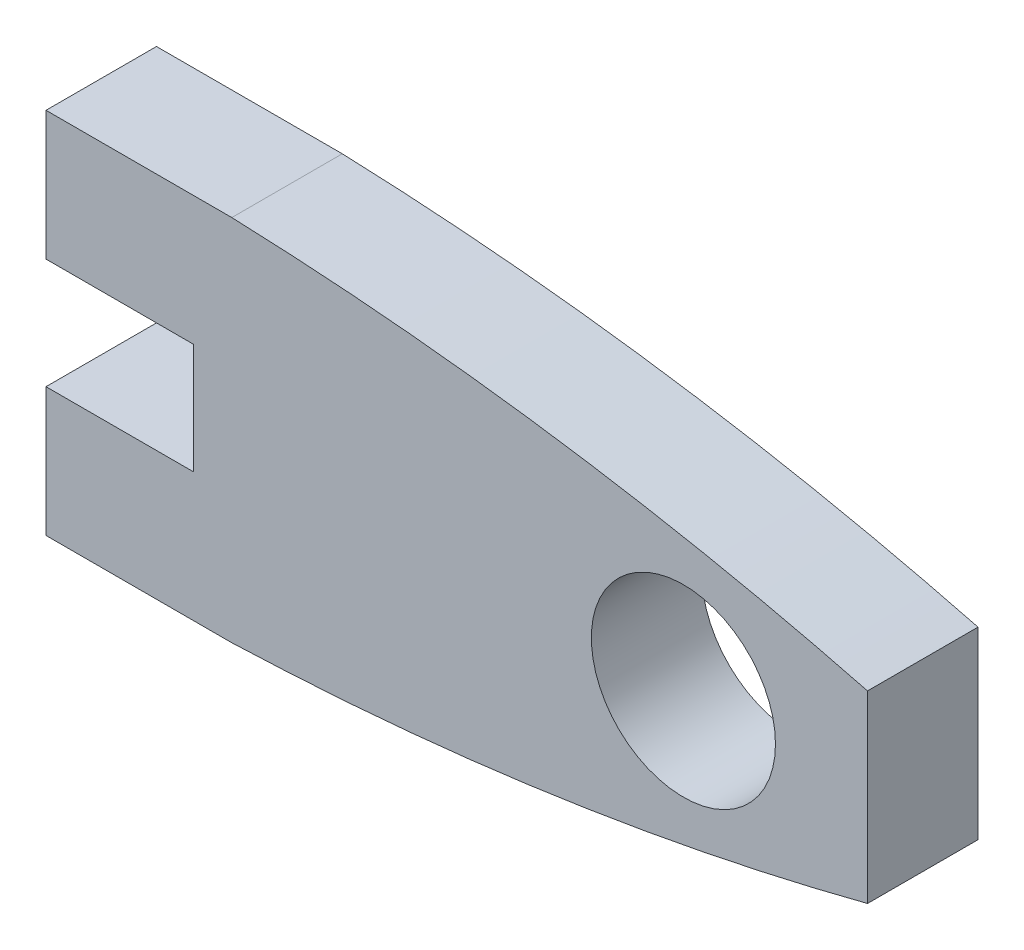
ISO-10303-21;
HEADER;
FILE_DESCRIPTION(('STEP AP214'),'2;1');
FILE_NAME('part.step','',(''),(''),'','','');
FILE_SCHEMA(('AUTOMOTIVE_DESIGN { 1 0 10303 214 1 1 1 1 }'));
ENDSEC;
DATA;
#1=APPLICATION_CONTEXT('core data for automotive mechanical design processes');
#2=APPLICATION_PROTOCOL_DEFINITION('international standard','automotive_design',2000,#1);
#3=PRODUCT_CONTEXT('',#1,'mechanical');
#4=PRODUCT('Part','Part','',(#3));
#5=PRODUCT_RELATED_PRODUCT_CATEGORY('part','',(#4));
#6=PRODUCT_DEFINITION_FORMATION('','',#4);
#7=PRODUCT_DEFINITION_CONTEXT('part definition',#1,'design');
#8=PRODUCT_DEFINITION('design','',#6,#7);
#9=PRODUCT_DEFINITION_SHAPE('','',#8);
#10=(LENGTH_UNIT() NAMED_UNIT(*) SI_UNIT(.MILLI.,.METRE.));
#11=(NAMED_UNIT(*) PLANE_ANGLE_UNIT() SI_UNIT($,.RADIAN.));
#12=(NAMED_UNIT(*) SI_UNIT($,.STERADIAN.) SOLID_ANGLE_UNIT());
#13=UNCERTAINTY_MEASURE_WITH_UNIT(LENGTH_MEASURE(1.E-05),#10,'distance_accuracy_value','');
#14=(GEOMETRIC_REPRESENTATION_CONTEXT(3) GLOBAL_UNCERTAINTY_ASSIGNED_CONTEXT((#13)) GLOBAL_UNIT_ASSIGNED_CONTEXT((#10,
#11,#12)) REPRESENTATION_CONTEXT('',''));
#15=CARTESIAN_POINT('',(0.,0.,0.));
#16=DIRECTION('',(0.,0.,1.));
#17=DIRECTION('',(1.,0.,0.));
#18=AXIS2_PLACEMENT_3D('',#15,#16,#17);
#19=CARTESIAN_POINT('',(0.,-4.99999999999999,3.));
#20=DIRECTION('',(0.,1.,0.));
#21=DIRECTION('',(0.,0.,1.));
#22=AXIS2_PLACEMENT_3D('',#19,#20,#21);
#23=PLANE('',#22);
#24=DIRECTION('',(1.,0.,0.));
#25=VECTOR('',#24,1.);
#26=CARTESIAN_POINT('',(0.,-4.99999999999999,3.));
#27=LINE('',#26,#25);
#28=CARTESIAN_POINT('',(-10.6544117647059,-4.99999999999999,3.));
#29=VERTEX_POINT('',#28);
#30=CARTESIAN_POINT('',(-5.60878524619494,-4.99999999999999,3.));
#31=VERTEX_POINT('',#30);
#32=EDGE_CURVE('E123',#29,#31,#27,.T.);
#33=ORIENTED_EDGE('',*,*,#32,.F.);
#34=DIRECTION('',(0.,0.,1.));
#35=VECTOR('',#34,1.);
#36=CARTESIAN_POINT('',(-10.6544117647059,-4.99999999999999,-0.00100000000000013));
#37=LINE('',#36,#35);
#38=CARTESIAN_POINT('',(-10.6544117647059,-4.99999999999999,0.));
#39=VERTEX_POINT('',#38);
#40=EDGE_CURVE('E110',#39,#29,#37,.T.);
#41=ORIENTED_EDGE('',*,*,#40,.F.);
#42=DIRECTION('',(1.,0.,0.));
#43=VECTOR('',#42,1.);
#44=CARTESIAN_POINT('',(0.,-4.99999999999999,0.));
#45=LINE('',#44,#43);
#46=CARTESIAN_POINT('',(-5.60878524619494,-4.99999999999999,0.));
#47=VERTEX_POINT('',#46);
#48=EDGE_CURVE('E295',#39,#47,#45,.T.);
#49=ORIENTED_EDGE('',*,*,#48,.T.);
#50=DIRECTION('',(0.,0.,-1.));
#51=VECTOR('',#50,1.);
#52=CARTESIAN_POINT('',(-5.60878524619494,-4.99999999999999,3.));
#53=LINE('',#52,#51);
#54=EDGE_CURVE('E11',#31,#47,#53,.T.);
#55=ORIENTED_EDGE('',*,*,#54,.F.);
#56=EDGE_LOOP('',(#33,#41,#49,#55));
#57=FACE_BOUND('',#56,.T.);
#58=ADVANCED_FACE('F35',(#57),#23,.F.);
#59=CARTESIAN_POINT('',(-11.6544117647059,-4.99999999999999,3.));
#60=CARTESIAN_POINT('',(0.349854090838662,-5.42490098130325,3.));
#61=CARTESIAN_POINT('',(11.6544117647059,-2.5,3.));
#62=B_SPLINE_CURVE_WITH_KNOTS('',2,(#59,#60,#61),.UNSPECIFIED.,.F.,.F.,(3,3),(0.,
0.737930507445409),.UNSPECIFIED.);
#63=DIRECTION('',(0.,0.,-1.));
#64=VECTOR('',#63,1.);
#65=SURFACE_OF_LINEAR_EXTRUSION('',#62,#64);
#66=CARTESIAN_POINT('',(-11.6544117647059,-4.99999999999999,0.));
#67=CARTESIAN_POINT('',(0.349854090838662,-5.42490098130325,0.));
#68=CARTESIAN_POINT('',(11.6544117647059,-2.5,0.));
#69=B_SPLINE_CURVE_WITH_KNOTS('',2,(#66,#67,#68),.UNSPECIFIED.,.F.,.F.,(3,3),(0.,
0.737930507445409),.UNSPECIFIED.);
#70=CARTESIAN_POINT('',(11.6544117647059,-2.5,0.));
#71=VERTEX_POINT('',#70);
#72=EDGE_CURVE('E298',#47,#71,#69,.T.);
#73=ORIENTED_EDGE('',*,*,#72,.T.);
#74=DIRECTION('',(0.,0.,-1.));
#75=VECTOR('',#74,1.);
#76=CARTESIAN_POINT('',(11.6544117647059,-2.5,3.));
#77=LINE('',#76,#75);
#78=CARTESIAN_POINT('',(11.6544117647059,-2.5,3.));
#79=VERTEX_POINT('',#78);
#80=EDGE_CURVE('E43',#79,#71,#77,.T.);
#81=ORIENTED_EDGE('',*,*,#80,.F.);
#82=EDGE_CURVE('E129',#31,#79,#62,.T.);
#83=ORIENTED_EDGE('',*,*,#82,.F.);
#84=ORIENTED_EDGE('',*,*,#54,.T.);
#85=EDGE_LOOP('',(#73,#81,#83,#84));
#86=FACE_BOUND('',#85,.T.);
#87=ADVANCED_FACE('F147',(#86),#65,.F.);
#88=CARTESIAN_POINT('',(11.6544117647059,0.,3.));
#89=DIRECTION('',(1.,0.,0.));
#90=DIRECTION('',(0.,1.,0.));
#91=AXIS2_PLACEMENT_3D('',#88,#89,#90);
#92=PLANE('',#91);
#93=DIRECTION('',(0.,-1.,0.));
#94=VECTOR('',#93,1.);
#95=CARTESIAN_POINT('',(11.6544117647059,0.,0.));
#96=LINE('',#95,#94);
#97=CARTESIAN_POINT('',(11.6544117647059,2.5,0.));
#98=VERTEX_POINT('',#97);
#99=EDGE_CURVE('E303',#98,#71,#96,.T.);
#100=ORIENTED_EDGE('',*,*,#99,.F.);
#101=DIRECTION('',(0.,0.,-1.));
#102=VECTOR('',#101,1.);
#103=CARTESIAN_POINT('',(11.6544117647059,2.5,3.));
#104=LINE('',#103,#102);
#105=CARTESIAN_POINT('',(11.6544117647059,2.5,3.));
#106=VERTEX_POINT('',#105);
#107=EDGE_CURVE('E323',#106,#98,#104,.T.);
#108=ORIENTED_EDGE('',*,*,#107,.F.);
#109=DIRECTION('',(0.,-1.,0.));
#110=VECTOR('',#109,1.);
#111=CARTESIAN_POINT('',(11.6544117647059,0.,3.));
#112=LINE('',#111,#110);
#113=EDGE_CURVE('E132',#106,#79,#112,.T.);
#114=ORIENTED_EDGE('',*,*,#113,.T.);
#115=ORIENTED_EDGE('',*,*,#80,.T.);
#116=EDGE_LOOP('',(#100,#108,#114,#115));
#117=FACE_BOUND('',#116,.T.);
#118=ADVANCED_FACE('F150',(#117),#92,.T.);
#119=CARTESIAN_POINT('',(-11.6544117647059,4.99999999999999,3.));
#120=CARTESIAN_POINT('',(0.349854090838653,5.42490098130326,3.));
#121=CARTESIAN_POINT('',(11.6544117647059,2.5,3.));
#122=B_SPLINE_CURVE_WITH_KNOTS('',2,(#119,#120,#121),.UNSPECIFIED.,.F.,.F.,(3,3),(0.,
0.73793050744541),.UNSPECIFIED.);
#123=DIRECTION('',(0.,0.,-1.));
#124=VECTOR('',#123,1.);
#125=SURFACE_OF_LINEAR_EXTRUSION('',#122,#124);
#126=CARTESIAN_POINT('',(-11.6544117647059,4.99999999999999,0.));
#127=CARTESIAN_POINT('',(0.349854090838653,5.42490098130326,0.));
#128=CARTESIAN_POINT('',(11.6544117647059,2.5,0.));
#129=B_SPLINE_CURVE_WITH_KNOTS('',2,(#126,#127,#128),.UNSPECIFIED.,.F.,.F.,(3,3),(0.,
0.73793050744541),.UNSPECIFIED.);
#130=CARTESIAN_POINT('',(-5.6087852461947,4.99999999999999,0.));
#131=VERTEX_POINT('',#130);
#132=EDGE_CURVE('E309',#131,#98,#129,.T.);
#133=ORIENTED_EDGE('',*,*,#132,.F.);
#134=DIRECTION('',(0.,0.,-1.));
#135=VECTOR('',#134,1.);
#136=CARTESIAN_POINT('',(-5.6087852461947,4.99999999999999,3.));
#137=LINE('',#136,#135);
#138=CARTESIAN_POINT('',(-5.6087852461947,4.99999999999999,3.));
#139=VERTEX_POINT('',#138);
#140=EDGE_CURVE('E291',#139,#131,#137,.T.);
#141=ORIENTED_EDGE('',*,*,#140,.F.);
#142=EDGE_CURVE('E278',#139,#106,#122,.T.);
#143=ORIENTED_EDGE('',*,*,#142,.T.);
#144=ORIENTED_EDGE('',*,*,#107,.T.);
#145=EDGE_LOOP('',(#133,#141,#143,#144));
#146=FACE_BOUND('',#145,.T.);
#147=ADVANCED_FACE('F168',(#146),#125,.T.);
#148=CARTESIAN_POINT('',(0.,4.99999999999999,3.));
#149=DIRECTION('',(0.,1.,0.));
#150=DIRECTION('',(-1.,0.,0.));
#151=AXIS2_PLACEMENT_3D('',#148,#149,#150);
#152=PLANE('',#151);
#153=DIRECTION('',(0.,0.,1.));
#154=VECTOR('',#153,1.);
#155=CARTESIAN_POINT('',(-10.6544117647059,4.99999999999999,-0.00100000000000013));
#156=LINE('',#155,#154);
#157=CARTESIAN_POINT('',(-10.6544117647059,4.99999999999999,0.));
#158=VERTEX_POINT('',#157);
#159=CARTESIAN_POINT('',(-10.6544117647059,4.99999999999999,3.));
#160=VERTEX_POINT('',#159);
#161=EDGE_CURVE('E339',#158,#160,#156,.T.);
#162=ORIENTED_EDGE('',*,*,#161,.T.);
#163=DIRECTION('',(1.,0.,0.));
#164=VECTOR('',#163,1.);
#165=CARTESIAN_POINT('',(0.,4.99999999999999,3.));
#166=LINE('',#165,#164);
#167=EDGE_CURVE('E284',#160,#139,#166,.T.);
#168=ORIENTED_EDGE('',*,*,#167,.T.);
#169=ORIENTED_EDGE('',*,*,#140,.T.);
#170=DIRECTION('',(1.,0.,0.));
#171=VECTOR('',#170,1.);
#172=CARTESIAN_POINT('',(0.,4.99999999999999,0.));
#173=LINE('',#172,#171);
#174=EDGE_CURVE('E314',#158,#131,#173,.T.);
#175=ORIENTED_EDGE('',*,*,#174,.F.);
#176=EDGE_LOOP('',(#162,#168,#169,#175));
#177=FACE_BOUND('',#176,.T.);
#178=ADVANCED_FACE('F175',(#177),#152,.T.);
#179=CARTESIAN_POINT('',(-6.65441176470586,0.,3.));
#180=DIRECTION('',(1.,0.,0.));
#181=DIRECTION('',(0.,1.,0.));
#182=AXIS2_PLACEMENT_3D('',#179,#180,#181);
#183=PLANE('',#182);
#184=DIRECTION('',(0.,-1.,0.));
#185=VECTOR('',#184,1.);
#186=CARTESIAN_POINT('',(-6.65441176470586,0.,0.));
#187=LINE('',#186,#185);
#188=CARTESIAN_POINT('',(-6.65441176470587,1.5,0.));
#189=VERTEX_POINT('',#188);
#190=CARTESIAN_POINT('',(-6.65441176470587,-1.5,0.));
#191=VERTEX_POINT('',#190);
#192=EDGE_CURVE('E135',#189,#191,#187,.T.);
#193=ORIENTED_EDGE('',*,*,#192,.T.);
#194=DIRECTION('',(0.,0.,1.));
#195=VECTOR('',#194,1.);
#196=CARTESIAN_POINT('',(-6.65441176470587,-1.5,0.));
#197=LINE('',#196,#195);
#198=CARTESIAN_POINT('',(-6.65441176470587,-1.5,3.));
#199=VERTEX_POINT('',#198);
#200=EDGE_CURVE('E349',#191,#199,#197,.T.);
#201=ORIENTED_EDGE('',*,*,#200,.T.);
#202=DIRECTION('',(0.,-1.,0.));
#203=VECTOR('',#202,1.);
#204=CARTESIAN_POINT('',(-6.65441176470586,0.,3.));
#205=LINE('',#204,#203);
#206=CARTESIAN_POINT('',(-6.65441176470587,1.5,3.));
#207=VERTEX_POINT('',#206);
#208=EDGE_CURVE('E289',#207,#199,#205,.T.);
#209=ORIENTED_EDGE('',*,*,#208,.F.);
#210=DIRECTION('',(0.,0.,1.));
#211=VECTOR('',#210,1.);
#212=CARTESIAN_POINT('',(-6.65441176470587,1.5,0.));
#213=LINE('',#212,#211);
#214=EDGE_CURVE('E296',#189,#207,#213,.T.);
#215=ORIENTED_EDGE('',*,*,#214,.F.);
#216=EDGE_LOOP('',(#193,#201,#209,#215));
#217=FACE_BOUND('',#216,.T.);
#218=ADVANCED_FACE('F182',(#217),#183,.F.);
#219=CARTESIAN_POINT('',(6.65441176470586,0.,3.));
#220=DIRECTION('',(0.,0.,-1.));
#221=DIRECTION('',(-1.,0.,0.));
#222=AXIS2_PLACEMENT_3D('',#219,#220,#221);
#223=CYLINDRICAL_SURFACE('',#222,2.5);
#224=CARTESIAN_POINT('',(6.65441176470586,0.,3.));
#225=DIRECTION('',(0.,0.,1.));
#226=DIRECTION('',(1.,0.,0.));
#227=AXIS2_PLACEMENT_3D('',#224,#225,#226);
#228=CIRCLE('',#227,2.5);
#229=CARTESIAN_POINT('',(9.15441176470586,0.,3.));
#230=VERTEX_POINT('',#229);
#231=EDGE_CURVE('E130',#230,#230,#228,.T.);
#232=ORIENTED_EDGE('',*,*,#231,.T.);
#233=EDGE_LOOP('',(#232));
#234=FACE_BOUND('',#233,.T.);
#235=CARTESIAN_POINT('',(6.65441176470586,0.,0.));
#236=DIRECTION('',(0.,0.,1.));
#237=DIRECTION('',(1.,0.,0.));
#238=AXIS2_PLACEMENT_3D('',#235,#236,#237);
#239=CIRCLE('',#238,2.5);
#240=CARTESIAN_POINT('',(9.15441176470586,0.,0.));
#241=VERTEX_POINT('',#240);
#242=EDGE_CURVE('E292',#241,#241,#239,.T.);
#243=ORIENTED_EDGE('',*,*,#242,.F.);
#244=EDGE_LOOP('',(#243));
#245=FACE_BOUND('',#244,.T.);
#246=ADVANCED_FACE('F37',(#234,#245),#223,.F.);
#247=CARTESIAN_POINT('',(0.,0.,3.));
#248=DIRECTION('',(0.,0.,1.));
#249=DIRECTION('',(1.,0.,0.));
#250=AXIS2_PLACEMENT_3D('',#247,#248,#249);
#251=PLANE('',#250);
#252=DIRECTION('',(0.,1.,0.));
#253=VECTOR('',#252,1.);
#254=CARTESIAN_POINT('',(-10.6544117647059,-1.5,3.));
#255=LINE('',#254,#253);
#256=CARTESIAN_POINT('',(-10.6544117647059,-1.5,3.));
#257=VERTEX_POINT('',#256);
#258=EDGE_CURVE('E50',#29,#257,#255,.T.);
#259=ORIENTED_EDGE('',*,*,#258,.F.);
#260=ORIENTED_EDGE('',*,*,#32,.T.);
#261=ORIENTED_EDGE('',*,*,#82,.T.);
#262=ORIENTED_EDGE('',*,*,#113,.F.);
#263=ORIENTED_EDGE('',*,*,#142,.F.);
#264=ORIENTED_EDGE('',*,*,#167,.F.);
#265=DIRECTION('',(0.,1.,0.));
#266=VECTOR('',#265,1.);
#267=CARTESIAN_POINT('',(-10.6544117647059,4.99999999999999,3.));
#268=LINE('',#267,#266);
#269=CARTESIAN_POINT('',(-10.6544117647059,1.5,3.));
#270=VERTEX_POINT('',#269);
#271=EDGE_CURVE('E336',#270,#160,#268,.T.);
#272=ORIENTED_EDGE('',*,*,#271,.F.);
#273=DIRECTION('',(1.,0.,0.));
#274=VECTOR('',#273,1.);
#275=CARTESIAN_POINT('',(-11.6544117647059,1.5,3.));
#276=LINE('',#275,#274);
#277=EDGE_CURVE('E353',#270,#207,#276,.T.);
#278=ORIENTED_EDGE('',*,*,#277,.T.);
#279=ORIENTED_EDGE('',*,*,#208,.T.);
#280=DIRECTION('',(-1.,0.,0.));
#281=VECTOR('',#280,1.);
#282=CARTESIAN_POINT('',(-11.6544117647059,-1.5,3.));
#283=LINE('',#282,#281);
#284=EDGE_CURVE('E126',#199,#257,#283,.T.);
#285=ORIENTED_EDGE('',*,*,#284,.T.);
#286=EDGE_LOOP('',(#259,#260,#261,#262,#263,#264,#272,#278,#279,#285));
#287=FACE_BOUND('',#286,.T.);
#288=ORIENTED_EDGE('',*,*,#231,.F.);
#289=EDGE_LOOP('',(#288));
#290=FACE_BOUND('',#289,.T.);
#291=ADVANCED_FACE('F121',(#287,#290),#251,.T.);
#292=CARTESIAN_POINT('',(0.,0.,0.));
#293=DIRECTION('',(0.,0.,1.));
#294=DIRECTION('',(1.,0.,0.));
#295=AXIS2_PLACEMENT_3D('',#292,#293,#294);
#296=PLANE('',#295);
#297=ORIENTED_EDGE('',*,*,#48,.F.);
#298=DIRECTION('',(0.,-1.,0.));
#299=VECTOR('',#298,1.);
#300=CARTESIAN_POINT('',(-10.6544117647059,-1.5,0.));
#301=LINE('',#300,#299);
#302=CARTESIAN_POINT('',(-10.6544117647059,-1.5,0.));
#303=VERTEX_POINT('',#302);
#304=EDGE_CURVE('E113',#303,#39,#301,.T.);
#305=ORIENTED_EDGE('',*,*,#304,.F.);
#306=DIRECTION('',(-1.,0.,0.));
#307=VECTOR('',#306,1.);
#308=CARTESIAN_POINT('',(-11.6544117647059,-1.5,0.));
#309=LINE('',#308,#307);
#310=EDGE_CURVE('E342',#191,#303,#309,.T.);
#311=ORIENTED_EDGE('',*,*,#310,.F.);
#312=ORIENTED_EDGE('',*,*,#192,.F.);
#313=DIRECTION('',(1.,0.,0.));
#314=VECTOR('',#313,1.);
#315=CARTESIAN_POINT('',(-11.6544117647059,1.5,0.));
#316=LINE('',#315,#314);
#317=CARTESIAN_POINT('',(-10.6544117647059,1.5,0.));
#318=VERTEX_POINT('',#317);
#319=EDGE_CURVE('E354',#318,#189,#316,.T.);
#320=ORIENTED_EDGE('',*,*,#319,.F.);
#321=DIRECTION('',(0.,-1.,0.));
#322=VECTOR('',#321,1.);
#323=CARTESIAN_POINT('',(-10.6544117647059,4.99999999999999,0.));
#324=LINE('',#323,#322);
#325=EDGE_CURVE('E58',#158,#318,#324,.T.);
#326=ORIENTED_EDGE('',*,*,#325,.F.);
#327=ORIENTED_EDGE('',*,*,#174,.T.);
#328=ORIENTED_EDGE('',*,*,#132,.T.);
#329=ORIENTED_EDGE('',*,*,#99,.T.);
#330=ORIENTED_EDGE('',*,*,#72,.F.);
#331=EDGE_LOOP('',(#297,#305,#311,#312,#320,#326,#327,#328,#329,#330));
#332=FACE_BOUND('',#331,.T.);
#333=ORIENTED_EDGE('',*,*,#242,.T.);
#334=EDGE_LOOP('',(#333));
#335=FACE_BOUND('',#334,.T.);
#336=ADVANCED_FACE('F201',(#332,#335),#296,.F.);
#337=CARTESIAN_POINT('',(-11.6544117647059,1.5,0.));
#338=DIRECTION('',(0.,-1.,0.));
#339=DIRECTION('',(0.,0.,-1.));
#340=AXIS2_PLACEMENT_3D('',#337,#338,#339);
#341=PLANE('',#340);
#342=DIRECTION('',(0.,0.,1.));
#343=VECTOR('',#342,1.);
#344=CARTESIAN_POINT('',(-10.6544117647059,1.5,-0.00100000000000013));
#345=LINE('',#344,#343);
#346=EDGE_CURVE('E340',#318,#270,#345,.T.);
#347=ORIENTED_EDGE('',*,*,#346,.F.);
#348=ORIENTED_EDGE('',*,*,#319,.T.);
#349=ORIENTED_EDGE('',*,*,#214,.T.);
#350=ORIENTED_EDGE('',*,*,#277,.F.);
#351=EDGE_LOOP('',(#347,#348,#349,#350));
#352=FACE_BOUND('',#351,.T.);
#353=ADVANCED_FACE('F208',(#352),#341,.T.);
#354=CARTESIAN_POINT('',(-11.6544117647059,-1.5,0.));
#355=DIRECTION('',(0.,1.,0.));
#356=DIRECTION('',(0.,0.,1.));
#357=AXIS2_PLACEMENT_3D('',#354,#355,#356);
#358=PLANE('',#357);
#359=DIRECTION('',(0.,0.,1.));
#360=VECTOR('',#359,1.);
#361=CARTESIAN_POINT('',(-10.6544117647059,-1.5,-0.00100000000000013));
#362=LINE('',#361,#360);
#363=EDGE_CURVE('E117',#303,#257,#362,.T.);
#364=ORIENTED_EDGE('',*,*,#363,.T.);
#365=ORIENTED_EDGE('',*,*,#284,.F.);
#366=ORIENTED_EDGE('',*,*,#200,.F.);
#367=ORIENTED_EDGE('',*,*,#310,.T.);
#368=EDGE_LOOP('',(#364,#365,#366,#367));
#369=FACE_BOUND('',#368,.T.);
#370=ADVANCED_FACE('F216',(#369),#358,.T.);
#371=CARTESIAN_POINT('',(-10.6544117647059,4.99999999999999,-0.00100000000000013));
#372=DIRECTION('',(1.,0.,0.));
#373=DIRECTION('',(0.,0.,-1.));
#374=AXIS2_PLACEMENT_3D('',#371,#372,#373);
#375=PLANE('',#374);
#376=ORIENTED_EDGE('',*,*,#325,.T.);
#377=ORIENTED_EDGE('',*,*,#346,.T.);
#378=ORIENTED_EDGE('',*,*,#271,.T.);
#379=ORIENTED_EDGE('',*,*,#161,.F.);
#380=EDGE_LOOP('',(#376,#377,#378,#379));
#381=FACE_BOUND('',#380,.T.);
#382=ADVANCED_FACE('F224',(#381),#375,.F.);
#383=CARTESIAN_POINT('',(-10.6544117647059,-1.5,-0.00100000000000013));
#384=DIRECTION('',(1.,0.,0.));
#385=DIRECTION('',(0.,0.,-1.));
#386=AXIS2_PLACEMENT_3D('',#383,#384,#385);
#387=PLANE('',#386);
#388=ORIENTED_EDGE('',*,*,#304,.T.);
#389=ORIENTED_EDGE('',*,*,#40,.T.);
#390=ORIENTED_EDGE('',*,*,#258,.T.);
#391=ORIENTED_EDGE('',*,*,#363,.F.);
#392=EDGE_LOOP('',(#388,#389,#390,#391));
#393=FACE_BOUND('',#392,.T.);
#394=ADVANCED_FACE('F111',(#393),#387,.F.);
#395=CLOSED_SHELL('',(#58,#87,#118,#147,#178,#218,#246,#291,#336,#353,#370,#382,#394));
#396=MANIFOLD_SOLID_BREP('B2',#395);
#397=ADVANCED_BREP_SHAPE_REPRESENTATION('',(#18,#396),#14);
#398=SHAPE_DEFINITION_REPRESENTATION(#9,#397);
ENDSEC;
END-ISO-10303-21;
